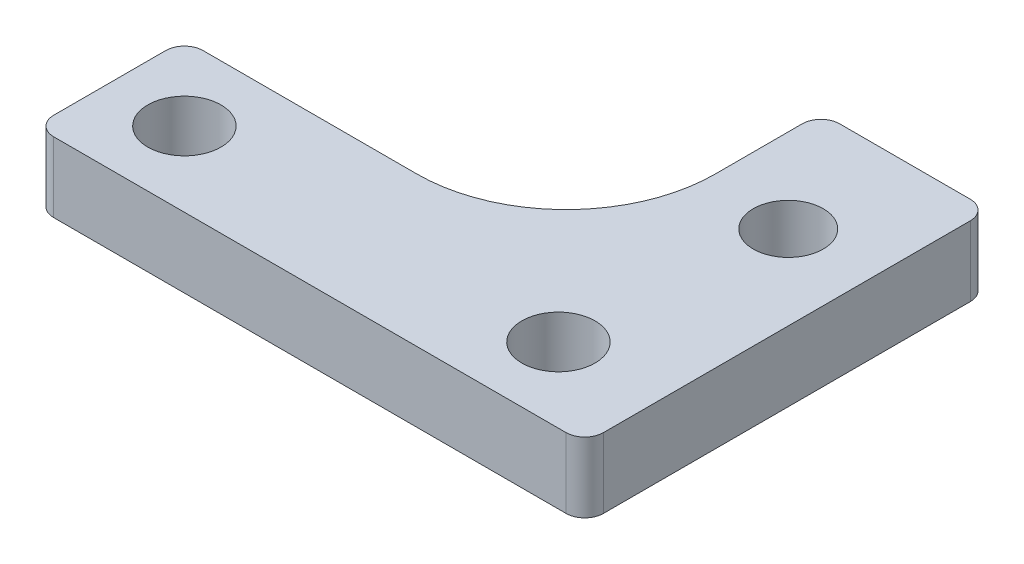
ISO-10303-21;
HEADER;
FILE_DESCRIPTION(('STEP AP214'),'2;1');
FILE_NAME('part.step','',(''),(''),'','','');
FILE_SCHEMA(('AUTOMOTIVE_DESIGN { 1 0 10303 214 1 1 1 1 }'));
ENDSEC;
DATA;
#1=APPLICATION_CONTEXT('core data for automotive mechanical design processes');
#2=APPLICATION_PROTOCOL_DEFINITION('international standard','automotive_design',2000,#1);
#3=PRODUCT_CONTEXT('',#1,'mechanical');
#4=PRODUCT('Part','Part','',(#3));
#5=PRODUCT_RELATED_PRODUCT_CATEGORY('part','',(#4));
#6=PRODUCT_DEFINITION_FORMATION('','',#4);
#7=PRODUCT_DEFINITION_CONTEXT('part definition',#1,'design');
#8=PRODUCT_DEFINITION('design','',#6,#7);
#9=PRODUCT_DEFINITION_SHAPE('','',#8);
#10=(LENGTH_UNIT() NAMED_UNIT(*) SI_UNIT(.MILLI.,.METRE.));
#11=(NAMED_UNIT(*) PLANE_ANGLE_UNIT() SI_UNIT($,.RADIAN.));
#12=(NAMED_UNIT(*) SI_UNIT($,.STERADIAN.) SOLID_ANGLE_UNIT());
#13=UNCERTAINTY_MEASURE_WITH_UNIT(LENGTH_MEASURE(1.E-05),#10,'distance_accuracy_value','');
#14=(GEOMETRIC_REPRESENTATION_CONTEXT(3) GLOBAL_UNCERTAINTY_ASSIGNED_CONTEXT((#13)) GLOBAL_UNIT_ASSIGNED_CONTEXT((#10,
#11,#12)) REPRESENTATION_CONTEXT('',''));
#15=CARTESIAN_POINT('',(0.,0.,0.));
#16=DIRECTION('',(0.,0.,1.));
#17=DIRECTION('',(1.,0.,0.));
#18=AXIS2_PLACEMENT_3D('',#15,#16,#17);
#19=CARTESIAN_POINT('',(0.,4.7625,0.));
#20=DIRECTION('',(0.,-1.,0.));
#21=DIRECTION('',(0.,0.,1.));
#22=AXIS2_PLACEMENT_3D('',#19,#20,#21);
#23=PLANE('',#22);
#24=CARTESIAN_POINT('',(225.214000168,4.7625,-382.0795));
#25=DIRECTION('',(0.,1.,0.));
#26=DIRECTION('',(0.,0.,1.));
#27=AXIS2_PLACEMENT_3D('',#24,#25,#26);
#28=CIRCLE('',#27,2.4892);
#29=CARTESIAN_POINT('',(225.214000168,4.7625,-379.5903));
#30=VERTEX_POINT('',#29);
#31=EDGE_CURVE('E256',#30,#30,#28,.T.);
#32=ORIENTED_EDGE('',*,*,#31,.T.);
#33=EDGE_LOOP('',(#32));
#34=FACE_BOUND('',#33,.T.);
#35=CARTESIAN_POINT('',(250.656000084,4.7625,-382.0795));
#36=DIRECTION('',(0.,1.,0.));
#37=DIRECTION('',(0.,0.,1.));
#38=AXIS2_PLACEMENT_3D('',#35,#36,#37);
#39=CIRCLE('',#38,2.48919999999997);
#40=CARTESIAN_POINT('',(250.656000084,4.7625,-379.5903));
#41=VERTEX_POINT('',#40);
#42=EDGE_CURVE('E250',#41,#41,#39,.T.);
#43=ORIENTED_EDGE('',*,*,#42,.T.);
#44=EDGE_LOOP('',(#43));
#45=FACE_BOUND('',#44,.T.);
#46=DIRECTION('',(1.,0.,0.));
#47=VECTOR('',#46,1.);
#48=CARTESIAN_POINT('',(257.526700084,4.7625,-376.9995));
#49=LINE('',#48,#47);
#50=CARTESIAN_POINT('',(221.404000168,4.7625,-376.9995));
#51=VERTEX_POINT('',#50);
#52=CARTESIAN_POINT('',(256.256700084,4.7625,-376.9995));
#53=VERTEX_POINT('',#52);
#54=EDGE_CURVE('E137',#51,#53,#49,.T.);
#55=ORIENTED_EDGE('',*,*,#54,.F.);
#56=CARTESIAN_POINT('',(221.404000168,4.7625,-378.2695));
#57=DIRECTION('',(0.,1.,0.));
#58=DIRECTION('',(0.,0.,1.));
#59=AXIS2_PLACEMENT_3D('',#56,#57,#58);
#60=CIRCLE('',#59,1.27);
#61=CARTESIAN_POINT('',(220.134000168,4.7625,-378.2695));
#62=VERTEX_POINT('',#61);
#63=EDGE_CURVE('E186',#62,#51,#60,.T.);
#64=ORIENTED_EDGE('',*,*,#63,.F.);
#65=DIRECTION('',(0.,0.,1.));
#66=VECTOR('',#65,1.);
#67=CARTESIAN_POINT('',(220.134000168,4.7625,-376.9995));
#68=LINE('',#67,#66);
#69=CARTESIAN_POINT('',(220.134000168,4.7625,-385.8895));
#70=VERTEX_POINT('',#69);
#71=EDGE_CURVE('E218',#70,#62,#68,.T.);
#72=ORIENTED_EDGE('',*,*,#71,.F.);
#73=CARTESIAN_POINT('',(221.404000168,4.7625,-385.8895));
#74=DIRECTION('',(0.,1.,0.));
#75=DIRECTION('',(0.,0.,1.));
#76=AXIS2_PLACEMENT_3D('',#73,#74,#75);
#77=CIRCLE('',#76,1.27);
#78=CARTESIAN_POINT('',(221.404000168,4.7625,-387.1595));
#79=VERTEX_POINT('',#78);
#80=EDGE_CURVE('E178',#79,#70,#77,.T.);
#81=ORIENTED_EDGE('',*,*,#80,.F.);
#82=DIRECTION('',(-1.,0.,0.));
#83=VECTOR('',#82,1.);
#84=CARTESIAN_POINT('',(220.134000168,4.7625,-387.1595));
#85=LINE('',#84,#83);
#86=CARTESIAN_POINT('',(235.936700084,4.7625,-387.1595));
#87=VERTEX_POINT('',#86);
#88=EDGE_CURVE('E216',#87,#79,#85,.T.);
#89=ORIENTED_EDGE('',*,*,#88,.F.);
#90=CARTESIAN_POINT('',(235.936700084,4.7625,-397.3195));
#91=DIRECTION('',(0.,1.,0.));
#92=DIRECTION('',(0.,0.,1.));
#93=AXIS2_PLACEMENT_3D('',#90,#91,#92);
#94=CIRCLE('',#93,10.16);
#95=CARTESIAN_POINT('',(246.096700084,4.7625,-397.3195));
#96=VERTEX_POINT('',#95);
#97=EDGE_CURVE('E132',#96,#87,#94,.F.);
#98=ORIENTED_EDGE('',*,*,#97,.F.);
#99=DIRECTION('',(0.,0.,1.));
#100=VECTOR('',#99,1.);
#101=CARTESIAN_POINT('',(246.096700084,4.7625,-404.495));
#102=LINE('',#101,#100);
#103=CARTESIAN_POINT('',(246.096700084,4.7625,-403.225));
#104=VERTEX_POINT('',#103);
#105=EDGE_CURVE('E209',#104,#96,#102,.T.);
#106=ORIENTED_EDGE('',*,*,#105,.F.);
#107=CARTESIAN_POINT('',(247.366700084,4.7625,-403.225));
#108=DIRECTION('',(0.,1.,0.));
#109=DIRECTION('',(0.,0.,1.));
#110=AXIS2_PLACEMENT_3D('',#107,#108,#109);
#111=CIRCLE('',#110,1.27);
#112=CARTESIAN_POINT('',(247.366700084,4.7625,-404.495));
#113=VERTEX_POINT('',#112);
#114=EDGE_CURVE('E183',#113,#104,#111,.T.);
#115=ORIENTED_EDGE('',*,*,#114,.F.);
#116=DIRECTION('',(-1.,0.,0.));
#117=VECTOR('',#116,1.);
#118=CARTESIAN_POINT('',(257.526700084,4.7625,-404.495));
#119=LINE('',#118,#117);
#120=CARTESIAN_POINT('',(256.256700084,4.7625,-404.495));
#121=VERTEX_POINT('',#120);
#122=EDGE_CURVE('E205',#121,#113,#119,.T.);
#123=ORIENTED_EDGE('',*,*,#122,.F.);
#124=CARTESIAN_POINT('',(256.256700084,4.7625,-403.225));
#125=DIRECTION('',(0.,1.,0.));
#126=DIRECTION('',(0.,0.,1.));
#127=AXIS2_PLACEMENT_3D('',#124,#125,#126);
#128=CIRCLE('',#127,1.27);
#129=CARTESIAN_POINT('',(257.526700084,4.7625,-403.225));
#130=VERTEX_POINT('',#129);
#131=EDGE_CURVE('E180',#130,#121,#128,.T.);
#132=ORIENTED_EDGE('',*,*,#131,.F.);
#133=DIRECTION('',(0.,0.,-1.));
#134=VECTOR('',#133,1.);
#135=CARTESIAN_POINT('',(257.526700084,4.7625,-376.9995));
#136=LINE('',#135,#134);
#137=CARTESIAN_POINT('',(257.526700084,4.7625,-378.2695));
#138=VERTEX_POINT('',#137);
#139=EDGE_CURVE('E210',#138,#130,#136,.T.);
#140=ORIENTED_EDGE('',*,*,#139,.F.);
#141=CARTESIAN_POINT('',(256.256700084,4.7625,-378.2695));
#142=DIRECTION('',(0.,1.,0.));
#143=DIRECTION('',(0.,0.,1.));
#144=AXIS2_PLACEMENT_3D('',#141,#142,#143);
#145=CIRCLE('',#144,1.27);
#146=EDGE_CURVE('E188',#53,#138,#145,.T.);
#147=ORIENTED_EDGE('',*,*,#146,.F.);
#148=EDGE_LOOP('',(#55,#64,#72,#81,#89,#98,#106,#115,#123,#132,#140,#147));
#149=FACE_BOUND('',#148,.T.);
#150=CARTESIAN_POINT('',(251.811700084,4.7625,-396.5575));
#151=DIRECTION('',(0.,1.,0.));
#152=DIRECTION('',(0.,0.,1.));
#153=AXIS2_PLACEMENT_3D('',#150,#151,#152);
#154=CIRCLE('',#153,2.38125000000001);
#155=CARTESIAN_POINT('',(251.811700084,4.7625,-398.93875));
#156=VERTEX_POINT('',#155);
#157=EDGE_CURVE('E228',#156,#156,#154,.T.);
#158=ORIENTED_EDGE('',*,*,#157,.T.);
#159=EDGE_LOOP('',(#158));
#160=FACE_BOUND('',#159,.T.);
#161=ADVANCED_FACE('F36',(#34,#45,#149,#160),#23,.T.);
#162=CARTESIAN_POINT('',(0.,9.525,0.));
#163=DIRECTION('',(0.,-1.,0.));
#164=DIRECTION('',(0.,0.,1.));
#165=AXIS2_PLACEMENT_3D('',#162,#163,#164);
#166=PLANE('',#165);
#167=CARTESIAN_POINT('',(225.214000168,9.525,-382.0795));
#168=DIRECTION('',(0.,1.,0.));
#169=DIRECTION('',(0.,0.,1.));
#170=AXIS2_PLACEMENT_3D('',#167,#168,#169);
#171=CIRCLE('',#170,2.4892);
#172=CARTESIAN_POINT('',(225.214000168,9.525,-379.5903));
#173=VERTEX_POINT('',#172);
#174=EDGE_CURVE('E253',#173,#173,#171,.T.);
#175=ORIENTED_EDGE('',*,*,#174,.F.);
#176=EDGE_LOOP('',(#175));
#177=FACE_BOUND('',#176,.T.);
#178=CARTESIAN_POINT('',(250.656000084,9.525,-382.0795));
#179=DIRECTION('',(0.,1.,0.));
#180=DIRECTION('',(0.,0.,1.));
#181=AXIS2_PLACEMENT_3D('',#178,#179,#180);
#182=CIRCLE('',#181,2.48920000000002);
#183=CARTESIAN_POINT('',(250.656000084,9.525,-379.5903));
#184=VERTEX_POINT('',#183);
#185=EDGE_CURVE('E245',#184,#184,#182,.T.);
#186=ORIENTED_EDGE('',*,*,#185,.F.);
#187=EDGE_LOOP('',(#186));
#188=FACE_BOUND('',#187,.T.);
#189=DIRECTION('',(0.,0.,-1.));
#190=VECTOR('',#189,1.);
#191=CARTESIAN_POINT('',(257.526700084,9.525,-376.9995));
#192=LINE('',#191,#190);
#193=CARTESIAN_POINT('',(257.526700084,9.525,-378.2695));
#194=VERTEX_POINT('',#193);
#195=CARTESIAN_POINT('',(257.526700084,9.525,-403.225));
#196=VERTEX_POINT('',#195);
#197=EDGE_CURVE('E225',#194,#196,#192,.T.);
#198=ORIENTED_EDGE('',*,*,#197,.T.);
#199=CARTESIAN_POINT('',(256.256700084,9.525,-403.225));
#200=DIRECTION('',(0.,1.,0.));
#201=DIRECTION('',(0.,0.,1.));
#202=AXIS2_PLACEMENT_3D('',#199,#200,#201);
#203=CIRCLE('',#202,1.27);
#204=CARTESIAN_POINT('',(256.256700084,9.525,-404.495));
#205=VERTEX_POINT('',#204);
#206=EDGE_CURVE('E163',#205,#196,#203,.F.);
#207=ORIENTED_EDGE('',*,*,#206,.F.);
#208=DIRECTION('',(-1.,0.,0.));
#209=VECTOR('',#208,1.);
#210=CARTESIAN_POINT('',(257.526700084,9.525,-404.495));
#211=LINE('',#210,#209);
#212=CARTESIAN_POINT('',(247.366700084,9.525,-404.495));
#213=VERTEX_POINT('',#212);
#214=EDGE_CURVE('E227',#205,#213,#211,.T.);
#215=ORIENTED_EDGE('',*,*,#214,.T.);
#216=CARTESIAN_POINT('',(247.366700084,9.525,-403.225));
#217=DIRECTION('',(0.,1.,0.));
#218=DIRECTION('',(0.,0.,1.));
#219=AXIS2_PLACEMENT_3D('',#216,#217,#218);
#220=CIRCLE('',#219,1.27);
#221=CARTESIAN_POINT('',(246.096700084,9.525,-403.225));
#222=VERTEX_POINT('',#221);
#223=EDGE_CURVE('E166',#222,#213,#220,.F.);
#224=ORIENTED_EDGE('',*,*,#223,.F.);
#225=DIRECTION('',(0.,0.,1.));
#226=VECTOR('',#225,1.);
#227=CARTESIAN_POINT('',(246.096700084,9.525,-404.495));
#228=LINE('',#227,#226);
#229=CARTESIAN_POINT('',(246.096700084,9.525,-397.3195));
#230=VERTEX_POINT('',#229);
#231=EDGE_CURVE('E146',#222,#230,#228,.T.);
#232=ORIENTED_EDGE('',*,*,#231,.T.);
#233=CARTESIAN_POINT('',(235.936700084,9.525,-397.3195));
#234=DIRECTION('',(0.,1.,0.));
#235=DIRECTION('',(0.,0.,1.));
#236=AXIS2_PLACEMENT_3D('',#233,#234,#235);
#237=CIRCLE('',#236,10.16);
#238=CARTESIAN_POINT('',(235.936700084,9.525,-387.1595));
#239=VERTEX_POINT('',#238);
#240=EDGE_CURVE('E129',#239,#230,#237,.T.);
#241=ORIENTED_EDGE('',*,*,#240,.F.);
#242=DIRECTION('',(-1.,0.,0.));
#243=VECTOR('',#242,1.);
#244=CARTESIAN_POINT('',(220.134000168,9.525,-387.1595));
#245=LINE('',#244,#243);
#246=CARTESIAN_POINT('',(221.404000168,9.525,-387.1595));
#247=VERTEX_POINT('',#246);
#248=EDGE_CURVE('E140',#239,#247,#245,.T.);
#249=ORIENTED_EDGE('',*,*,#248,.T.);
#250=CARTESIAN_POINT('',(221.404000168,9.525,-385.8895));
#251=DIRECTION('',(0.,1.,0.));
#252=DIRECTION('',(0.,0.,1.));
#253=AXIS2_PLACEMENT_3D('',#250,#251,#252);
#254=CIRCLE('',#253,1.27);
#255=CARTESIAN_POINT('',(220.134000168,9.525,-385.8895));
#256=VERTEX_POINT('',#255);
#257=EDGE_CURVE('E161',#256,#247,#254,.F.);
#258=ORIENTED_EDGE('',*,*,#257,.F.);
#259=DIRECTION('',(0.,0.,1.));
#260=VECTOR('',#259,1.);
#261=CARTESIAN_POINT('',(220.134000168,9.525,-376.9995));
#262=LINE('',#261,#260);
#263=CARTESIAN_POINT('',(220.134000168,9.525,-378.2695));
#264=VERTEX_POINT('',#263);
#265=EDGE_CURVE('E145',#256,#264,#262,.T.);
#266=ORIENTED_EDGE('',*,*,#265,.T.);
#267=CARTESIAN_POINT('',(221.404000168,9.525,-378.2695));
#268=DIRECTION('',(0.,1.,0.));
#269=DIRECTION('',(0.,0.,1.));
#270=AXIS2_PLACEMENT_3D('',#267,#268,#269);
#271=CIRCLE('',#270,1.27);
#272=CARTESIAN_POINT('',(221.404000168,9.525,-376.9995));
#273=VERTEX_POINT('',#272);
#274=EDGE_CURVE('E169',#273,#264,#271,.F.);
#275=ORIENTED_EDGE('',*,*,#274,.F.);
#276=DIRECTION('',(1.,0.,0.));
#277=VECTOR('',#276,1.);
#278=CARTESIAN_POINT('',(257.526700084,9.525,-376.9995));
#279=LINE('',#278,#277);
#280=CARTESIAN_POINT('',(256.256700084,9.525,-376.9995));
#281=VERTEX_POINT('',#280);
#282=EDGE_CURVE('E233',#273,#281,#279,.T.);
#283=ORIENTED_EDGE('',*,*,#282,.T.);
#284=CARTESIAN_POINT('',(256.256700084,9.525,-378.2695));
#285=DIRECTION('',(0.,1.,0.));
#286=DIRECTION('',(0.,0.,1.));
#287=AXIS2_PLACEMENT_3D('',#284,#285,#286);
#288=CIRCLE('',#287,1.27);
#289=EDGE_CURVE('E171',#194,#281,#288,.F.);
#290=ORIENTED_EDGE('',*,*,#289,.F.);
#291=EDGE_LOOP('',(#198,#207,#215,#224,#232,#241,#249,#258,#266,#275,#283,#290));
#292=FACE_BOUND('',#291,.T.);
#293=CARTESIAN_POINT('',(251.811700084,9.525,-396.5575));
#294=DIRECTION('',(0.,1.,0.));
#295=DIRECTION('',(0.,0.,1.));
#296=AXIS2_PLACEMENT_3D('',#293,#294,#295);
#297=CIRCLE('',#296,2.38125000000001);
#298=CARTESIAN_POINT('',(251.811700084,9.525,-398.93875));
#299=VERTEX_POINT('',#298);
#300=EDGE_CURVE('E242',#299,#299,#297,.T.);
#301=ORIENTED_EDGE('',*,*,#300,.F.);
#302=EDGE_LOOP('',(#301));
#303=FACE_BOUND('',#302,.T.);
#304=ADVANCED_FACE('F149',(#177,#188,#292,#303),#166,.F.);
#305=CARTESIAN_POINT('',(257.526700084,4.7625,-376.9995));
#306=DIRECTION('',(-1.,0.,0.));
#307=DIRECTION('',(0.,0.,1.));
#308=AXIS2_PLACEMENT_3D('',#305,#306,#307);
#309=PLANE('',#308);
#310=ORIENTED_EDGE('',*,*,#139,.T.);
#311=DIRECTION('',(0.,1.,0.));
#312=VECTOR('',#311,1.);
#313=CARTESIAN_POINT('',(257.526700084,4.7625,-403.225));
#314=LINE('',#313,#312);
#315=EDGE_CURVE('E154',#196,#130,#314,.F.);
#316=ORIENTED_EDGE('',*,*,#315,.F.);
#317=ORIENTED_EDGE('',*,*,#197,.F.);
#318=DIRECTION('',(0.,1.,0.));
#319=VECTOR('',#318,1.);
#320=CARTESIAN_POINT('',(257.526700084,4.7625,-378.2695));
#321=LINE('',#320,#319);
#322=EDGE_CURVE('E159',#138,#194,#321,.T.);
#323=ORIENTED_EDGE('',*,*,#322,.F.);
#324=EDGE_LOOP('',(#310,#316,#317,#323));
#325=FACE_BOUND('',#324,.T.);
#326=ADVANCED_FACE('F281',(#325),#309,.F.);
#327=CARTESIAN_POINT('',(257.526700084,4.7625,-404.495));
#328=DIRECTION('',(0.,0.,1.));
#329=DIRECTION('',(1.,0.,0.));
#330=AXIS2_PLACEMENT_3D('',#327,#328,#329);
#331=PLANE('',#330);
#332=ORIENTED_EDGE('',*,*,#214,.F.);
#333=DIRECTION('',(0.,1.,0.));
#334=VECTOR('',#333,1.);
#335=CARTESIAN_POINT('',(256.256700084,4.7625,-404.495));
#336=LINE('',#335,#334);
#337=EDGE_CURVE('E195',#121,#205,#336,.T.);
#338=ORIENTED_EDGE('',*,*,#337,.F.);
#339=ORIENTED_EDGE('',*,*,#122,.T.);
#340=DIRECTION('',(0.,1.,0.));
#341=VECTOR('',#340,1.);
#342=CARTESIAN_POINT('',(247.366700084,4.7625,-404.495));
#343=LINE('',#342,#341);
#344=EDGE_CURVE('E44',#213,#113,#343,.F.);
#345=ORIENTED_EDGE('',*,*,#344,.F.);
#346=EDGE_LOOP('',(#332,#338,#339,#345));
#347=FACE_BOUND('',#346,.T.);
#348=ADVANCED_FACE('F206',(#347),#331,.F.);
#349=CARTESIAN_POINT('',(246.096700084,4.7625,-404.495));
#350=DIRECTION('',(1.,0.,0.));
#351=DIRECTION('',(0.,0.,-1.));
#352=AXIS2_PLACEMENT_3D('',#349,#350,#351);
#353=PLANE('',#352);
#354=ORIENTED_EDGE('',*,*,#105,.T.);
#355=DIRECTION('',(0.,1.,0.));
#356=VECTOR('',#355,1.);
#357=CARTESIAN_POINT('',(246.096700084,4.7625,-397.3195));
#358=LINE('',#357,#356);
#359=EDGE_CURVE('E136',#230,#96,#358,.F.);
#360=ORIENTED_EDGE('',*,*,#359,.F.);
#361=ORIENTED_EDGE('',*,*,#231,.F.);
#362=DIRECTION('',(0.,1.,0.));
#363=VECTOR('',#362,1.);
#364=CARTESIAN_POINT('',(246.096700084,4.7625,-403.225));
#365=LINE('',#364,#363);
#366=EDGE_CURVE('E193',#104,#222,#365,.T.);
#367=ORIENTED_EDGE('',*,*,#366,.F.);
#368=EDGE_LOOP('',(#354,#360,#361,#367));
#369=FACE_BOUND('',#368,.T.);
#370=ADVANCED_FACE('F295',(#369),#353,.F.);
#371=CARTESIAN_POINT('',(220.134000168,4.7625,-387.1595));
#372=DIRECTION('',(0.,0.,1.));
#373=DIRECTION('',(1.,0.,0.));
#374=AXIS2_PLACEMENT_3D('',#371,#372,#373);
#375=PLANE('',#374);
#376=ORIENTED_EDGE('',*,*,#248,.F.);
#377=DIRECTION('',(0.,1.,0.));
#378=VECTOR('',#377,1.);
#379=CARTESIAN_POINT('',(235.936700084,9.525,-387.1595));
#380=LINE('',#379,#378);
#381=EDGE_CURVE('E125',#87,#239,#380,.T.);
#382=ORIENTED_EDGE('',*,*,#381,.F.);
#383=ORIENTED_EDGE('',*,*,#88,.T.);
#384=DIRECTION('',(0.,1.,0.));
#385=VECTOR('',#384,1.);
#386=CARTESIAN_POINT('',(221.404000168,4.7625,-387.1595));
#387=LINE('',#386,#385);
#388=EDGE_CURVE('E11',#247,#79,#387,.F.);
#389=ORIENTED_EDGE('',*,*,#388,.F.);
#390=EDGE_LOOP('',(#376,#382,#383,#389));
#391=FACE_BOUND('',#390,.T.);
#392=ADVANCED_FACE('F141',(#391),#375,.F.);
#393=CARTESIAN_POINT('',(220.134000168,4.7625,-376.9995));
#394=DIRECTION('',(1.,0.,0.));
#395=DIRECTION('',(0.,0.,-1.));
#396=AXIS2_PLACEMENT_3D('',#393,#394,#395);
#397=PLANE('',#396);
#398=ORIENTED_EDGE('',*,*,#265,.F.);
#399=DIRECTION('',(0.,1.,0.));
#400=VECTOR('',#399,1.);
#401=CARTESIAN_POINT('',(220.134000168,4.7625,-385.8895));
#402=LINE('',#401,#400);
#403=EDGE_CURVE('E58',#70,#256,#402,.T.);
#404=ORIENTED_EDGE('',*,*,#403,.F.);
#405=ORIENTED_EDGE('',*,*,#71,.T.);
#406=DIRECTION('',(0.,1.,0.));
#407=VECTOR('',#406,1.);
#408=CARTESIAN_POINT('',(220.134000168,4.7625,-378.2695));
#409=LINE('',#408,#407);
#410=EDGE_CURVE('E51',#264,#62,#409,.F.);
#411=ORIENTED_EDGE('',*,*,#410,.F.);
#412=EDGE_LOOP('',(#398,#404,#405,#411));
#413=FACE_BOUND('',#412,.T.);
#414=ADVANCED_FACE('F289',(#413),#397,.F.);
#415=CARTESIAN_POINT('',(257.526700084,4.7625,-376.9995));
#416=DIRECTION('',(0.,0.,-1.));
#417=DIRECTION('',(-1.,0.,0.));
#418=AXIS2_PLACEMENT_3D('',#415,#416,#417);
#419=PLANE('',#418);
#420=ORIENTED_EDGE('',*,*,#282,.F.);
#421=DIRECTION('',(0.,1.,0.));
#422=VECTOR('',#421,1.);
#423=CARTESIAN_POINT('',(221.404000168,4.7625,-376.9995));
#424=LINE('',#423,#422);
#425=EDGE_CURVE('E174',#51,#273,#424,.T.);
#426=ORIENTED_EDGE('',*,*,#425,.F.);
#427=ORIENTED_EDGE('',*,*,#54,.T.);
#428=DIRECTION('',(0.,1.,0.));
#429=VECTOR('',#428,1.);
#430=CARTESIAN_POINT('',(256.256700084,4.7625,-376.9995));
#431=LINE('',#430,#429);
#432=EDGE_CURVE('E176',#281,#53,#431,.F.);
#433=ORIENTED_EDGE('',*,*,#432,.F.);
#434=EDGE_LOOP('',(#420,#426,#427,#433));
#435=FACE_BOUND('',#434,.T.);
#436=ADVANCED_FACE('F286',(#435),#419,.F.);
#437=CARTESIAN_POINT('',(251.811700084,4.7625,-396.5575));
#438=DIRECTION('',(0.,1.,0.));
#439=DIRECTION('',(0.,0.,-1.));
#440=AXIS2_PLACEMENT_3D('',#437,#438,#439);
#441=CYLINDRICAL_SURFACE('',#440,2.38125000000001);
#442=CARTESIAN_POINT('',(251.811700084,4.7625,-398.93875));
#443=CARTESIAN_POINT('',(251.811700084,4.812109375,-398.93875));
#444=CARTESIAN_POINT('',(251.811700084,4.86171875,-398.93875));
#445=CARTESIAN_POINT('',(251.811700084,4.9609375,-398.93875));
#446=CARTESIAN_POINT('',(251.811700084,5.010546875,-398.93875));
#447=CARTESIAN_POINT('',(251.811700084,5.109765625,-398.93875));
#448=CARTESIAN_POINT('',(251.811700084,5.159375,-398.93875));
#449=CARTESIAN_POINT('',(251.811700084,5.25859375,-398.93875));
#450=CARTESIAN_POINT('',(251.811700084,5.308203125,-398.93875));
#451=CARTESIAN_POINT('',(251.811700084,5.407421875,-398.93875));
#452=CARTESIAN_POINT('',(251.811700084,5.45703125,-398.93875));
#453=CARTESIAN_POINT('',(251.811700084,5.55625,-398.93875));
#454=CARTESIAN_POINT('',(251.811700084,5.605859375,-398.93875));
#455=CARTESIAN_POINT('',(251.811700084,5.705078125,-398.93875));
#456=CARTESIAN_POINT('',(251.811700084,5.7546875,-398.93875));
#457=CARTESIAN_POINT('',(251.811700084,5.85390625,-398.93875));
#458=CARTESIAN_POINT('',(251.811700084,5.903515625,-398.93875));
#459=CARTESIAN_POINT('',(251.811700084,6.002734375,-398.93875));
#460=CARTESIAN_POINT('',(251.811700084,6.05234375,-398.93875));
#461=CARTESIAN_POINT('',(251.811700084,6.1515625,-398.93875));
#462=CARTESIAN_POINT('',(251.811700084,6.201171875,-398.93875));
#463=CARTESIAN_POINT('',(251.811700084,6.300390625,-398.93875));
#464=CARTESIAN_POINT('',(251.811700084,6.35,-398.93875));
#465=CARTESIAN_POINT('',(251.811700084,6.44921875,-398.93875));
#466=CARTESIAN_POINT('',(251.811700084,6.498828125,-398.93875));
#467=CARTESIAN_POINT('',(251.811700084,6.598046875,-398.93875));
#468=CARTESIAN_POINT('',(251.811700084,6.64765625,-398.93875));
#469=CARTESIAN_POINT('',(251.811700084,6.746875,-398.93875));
#470=CARTESIAN_POINT('',(251.811700084,6.796484375,-398.93875));
#471=CARTESIAN_POINT('',(251.811700084,6.895703125,-398.93875));
#472=CARTESIAN_POINT('',(251.811700084,6.9453125,-398.93875));
#473=CARTESIAN_POINT('',(251.811700084,7.04453125,-398.93875));
#474=CARTESIAN_POINT('',(251.811700084,7.094140625,-398.93875));
#475=CARTESIAN_POINT('',(251.811700084,7.193359375,-398.93875));
#476=CARTESIAN_POINT('',(251.811700084,7.24296875,-398.93875));
#477=CARTESIAN_POINT('',(251.811700084,7.3421875,-398.93875));
#478=CARTESIAN_POINT('',(251.811700084,7.391796875,-398.93875));
#479=CARTESIAN_POINT('',(251.811700084,7.491015625,-398.93875));
#480=CARTESIAN_POINT('',(251.811700084,7.540625,-398.93875));
#481=CARTESIAN_POINT('',(251.811700084,7.63984375,-398.93875));
#482=CARTESIAN_POINT('',(251.811700084,7.689453125,-398.93875));
#483=CARTESIAN_POINT('',(251.811700084,7.788671875,-398.93875));
#484=CARTESIAN_POINT('',(251.811700084,7.83828125,-398.93875));
#485=CARTESIAN_POINT('',(251.811700084,7.9375,-398.93875));
#486=CARTESIAN_POINT('',(251.811700084,7.987109375,-398.93875));
#487=CARTESIAN_POINT('',(251.811700084,8.086328125,-398.93875));
#488=CARTESIAN_POINT('',(251.811700084,8.1359375,-398.93875));
#489=CARTESIAN_POINT('',(251.811700084,8.23515625,-398.93875));
#490=CARTESIAN_POINT('',(251.811700084,8.284765625,-398.93875));
#491=CARTESIAN_POINT('',(251.811700084,8.383984375,-398.93875));
#492=CARTESIAN_POINT('',(251.811700084,8.43359375,-398.93875));
#493=CARTESIAN_POINT('',(251.811700084,8.5328125,-398.93875));
#494=CARTESIAN_POINT('',(251.811700084,8.582421875,-398.93875));
#495=CARTESIAN_POINT('',(251.811700084,8.681640625,-398.93875));
#496=CARTESIAN_POINT('',(251.811700084,8.73125,-398.93875));
#497=CARTESIAN_POINT('',(251.811700084,8.83046875,-398.93875));
#498=CARTESIAN_POINT('',(251.811700084,8.880078125,-398.93875));
#499=CARTESIAN_POINT('',(251.811700084,8.979296875,-398.93875));
#500=CARTESIAN_POINT('',(251.811700084,9.02890625,-398.93875));
#501=CARTESIAN_POINT('',(251.811700084,9.128125,-398.93875));
#502=CARTESIAN_POINT('',(251.811700084,9.177734375,-398.93875));
#503=CARTESIAN_POINT('',(251.811700084,9.276953125,-398.93875));
#504=CARTESIAN_POINT('',(251.811700084,9.3265625,-398.93875));
#505=CARTESIAN_POINT('',(251.811700084,9.42578125,-398.93875));
#506=CARTESIAN_POINT('',(251.811700084,9.475390625,-398.93875));
#507=CARTESIAN_POINT('',(251.811700084,9.525,-398.93875));
#508=B_SPLINE_CURVE_WITH_KNOTS('',3,(#442,#443,#444,#445,#446,#447,#448,#449,#450,#451,#452,
#453,#454,#455,#456,#457,#458,#459,#460,#461,#462,#463,#464,#465,#466,#467,#468,#469,#470,#471,
#472,#473,#474,#475,#476,#477,#478,#479,#480,#481,#482,#483,#484,#485,#486,#487,#488,#489,#490,
#491,#492,#493,#494,#495,#496,#497,#498,#499,#500,#501,#502,#503,#504,#505,#506,#507),
.UNSPECIFIED.,.F.,.F.,(4,2,2,2,2,2,2,2,2,2,2,2,2,2,2,2,2,2,2,2,2,2,2,2,2,2,2,2,2,2,2,2,4),(0.,
0.148828124999999,0.297656249999999,0.446484374999999,0.595312499999999,0.744140625,0.89296875,
1.041796875,1.190625,1.339453125,1.48828125,1.637109375,1.7859375,1.934765625,2.08359375,
2.232421875,2.38125,2.530078125,2.67890625,2.827734375,2.9765625,3.125390625,3.27421875,
3.423046875,3.571875,3.720703125,3.86953125,4.018359375,4.1671875,4.316015625,4.46484375,
4.613671875,4.7625),.UNSPECIFIED.);
#509=EDGE_CURVE('BSEAM273',#156,#299,#508,.T.);
#510=ORIENTED_EDGE('',*,*,#157,.F.);
#511=ORIENTED_EDGE('',*,*,#300,.T.);
#512=ORIENTED_EDGE('',*,*,#509,.T.);
#513=ORIENTED_EDGE('',*,*,#509,.F.);
#514=EDGE_LOOP('',(#510,#512,#511,#513));
#515=FACE_BOUND('',#514,.T.);
#516=ADVANCED_FACE('F273',(#515),#441,.F.);
#517=CARTESIAN_POINT('',(250.656000084,4.7625,-382.0795));
#518=DIRECTION('',(0.,-1.,0.));
#519=DIRECTION('',(0.,0.,1.));
#520=AXIS2_PLACEMENT_3D('',#517,#518,#519);
#521=CYLINDRICAL_SURFACE('',#520,2.4892);
#522=ORIENTED_EDGE('',*,*,#185,.T.);
#523=EDGE_LOOP('',(#522));
#524=FACE_BOUND('',#523,.T.);
#525=ORIENTED_EDGE('',*,*,#42,.F.);
#526=EDGE_LOOP('',(#525));
#527=FACE_BOUND('',#526,.T.);
#528=ADVANCED_FACE('F264',(#524,#527),#521,.F.);
#529=CARTESIAN_POINT('',(225.214000168,4.7625,-382.0795));
#530=DIRECTION('',(0.,-1.,0.));
#531=DIRECTION('',(0.,0.,1.));
#532=AXIS2_PLACEMENT_3D('',#529,#530,#531);
#533=CYLINDRICAL_SURFACE('',#532,2.4892);
#534=ORIENTED_EDGE('',*,*,#174,.T.);
#535=EDGE_LOOP('',(#534));
#536=FACE_BOUND('',#535,.T.);
#537=ORIENTED_EDGE('',*,*,#31,.F.);
#538=EDGE_LOOP('',(#537));
#539=FACE_BOUND('',#538,.T.);
#540=ADVANCED_FACE('F262',(#536,#539),#533,.F.);
#541=CARTESIAN_POINT('',(235.936700084,4.7625,-397.3195));
#542=DIRECTION('',(0.,-1.,0.));
#543=DIRECTION('',(0.,0.,1.));
#544=AXIS2_PLACEMENT_3D('',#541,#542,#543);
#545=CYLINDRICAL_SURFACE('',#544,10.16);
#546=ORIENTED_EDGE('',*,*,#97,.T.);
#547=ORIENTED_EDGE('',*,*,#381,.T.);
#548=ORIENTED_EDGE('',*,*,#240,.T.);
#549=ORIENTED_EDGE('',*,*,#359,.T.);
#550=EDGE_LOOP('',(#546,#547,#548,#549));
#551=FACE_BOUND('',#550,.T.);
#552=ADVANCED_FACE('F127',(#551),#545,.F.);
#553=CARTESIAN_POINT('',(256.256700084,4.7625,-378.2695));
#554=DIRECTION('',(0.,1.,0.));
#555=DIRECTION('',(0.,0.,-1.));
#556=AXIS2_PLACEMENT_3D('',#553,#554,#555);
#557=CYLINDRICAL_SURFACE('',#556,1.27);
#558=ORIENTED_EDGE('',*,*,#146,.T.);
#559=ORIENTED_EDGE('',*,*,#322,.T.);
#560=ORIENTED_EDGE('',*,*,#289,.T.);
#561=ORIENTED_EDGE('',*,*,#432,.T.);
#562=EDGE_LOOP('',(#558,#559,#560,#561));
#563=FACE_BOUND('',#562,.T.);
#564=ADVANCED_FACE('F271',(#563),#557,.T.);
#565=CARTESIAN_POINT('',(221.404000168,4.7625,-378.2695));
#566=DIRECTION('',(0.,1.,0.));
#567=DIRECTION('',(0.,0.,-1.));
#568=AXIS2_PLACEMENT_3D('',#565,#566,#567);
#569=CYLINDRICAL_SURFACE('',#568,1.27);
#570=ORIENTED_EDGE('',*,*,#63,.T.);
#571=ORIENTED_EDGE('',*,*,#425,.T.);
#572=ORIENTED_EDGE('',*,*,#274,.T.);
#573=ORIENTED_EDGE('',*,*,#410,.T.);
#574=EDGE_LOOP('',(#570,#571,#572,#573));
#575=FACE_BOUND('',#574,.T.);
#576=ADVANCED_FACE('F304',(#575),#569,.T.);
#577=CARTESIAN_POINT('',(247.366700084,4.7625,-403.225));
#578=DIRECTION('',(0.,1.,0.));
#579=DIRECTION('',(0.,0.,-1.));
#580=AXIS2_PLACEMENT_3D('',#577,#578,#579);
#581=CYLINDRICAL_SURFACE('',#580,1.27);
#582=ORIENTED_EDGE('',*,*,#114,.T.);
#583=ORIENTED_EDGE('',*,*,#366,.T.);
#584=ORIENTED_EDGE('',*,*,#223,.T.);
#585=ORIENTED_EDGE('',*,*,#344,.T.);
#586=EDGE_LOOP('',(#582,#583,#584,#585));
#587=FACE_BOUND('',#586,.T.);
#588=ADVANCED_FACE('F198',(#587),#581,.T.);
#589=CARTESIAN_POINT('',(256.256700084,4.7625,-403.225));
#590=DIRECTION('',(0.,1.,0.));
#591=DIRECTION('',(0.,0.,-1.));
#592=AXIS2_PLACEMENT_3D('',#589,#590,#591);
#593=CYLINDRICAL_SURFACE('',#592,1.27);
#594=ORIENTED_EDGE('',*,*,#131,.T.);
#595=ORIENTED_EDGE('',*,*,#337,.T.);
#596=ORIENTED_EDGE('',*,*,#206,.T.);
#597=ORIENTED_EDGE('',*,*,#315,.T.);
#598=EDGE_LOOP('',(#594,#595,#596,#597));
#599=FACE_BOUND('',#598,.T.);
#600=ADVANCED_FACE('F309',(#599),#593,.T.);
#601=CARTESIAN_POINT('',(221.404000168,4.7625,-385.8895));
#602=DIRECTION('',(0.,1.,0.));
#603=DIRECTION('',(0.,0.,-1.));
#604=AXIS2_PLACEMENT_3D('',#601,#602,#603);
#605=CYLINDRICAL_SURFACE('',#604,1.27);
#606=ORIENTED_EDGE('',*,*,#80,.T.);
#607=ORIENTED_EDGE('',*,*,#403,.T.);
#608=ORIENTED_EDGE('',*,*,#257,.T.);
#609=ORIENTED_EDGE('',*,*,#388,.T.);
#610=EDGE_LOOP('',(#606,#607,#608,#609));
#611=FACE_BOUND('',#610,.T.);
#612=ADVANCED_FACE('F38',(#611),#605,.T.);
#613=CLOSED_SHELL('',(#161,#304,#326,#348,#370,#392,#414,#436,#516,#528,#540,#552,#564,#576,
#588,#600,#612));
#614=MANIFOLD_SOLID_BREP('B2',#613);
#615=ADVANCED_BREP_SHAPE_REPRESENTATION('',(#18,#614),#14);
#616=SHAPE_DEFINITION_REPRESENTATION(#9,#615);
ENDSEC;
END-ISO-10303-21;
